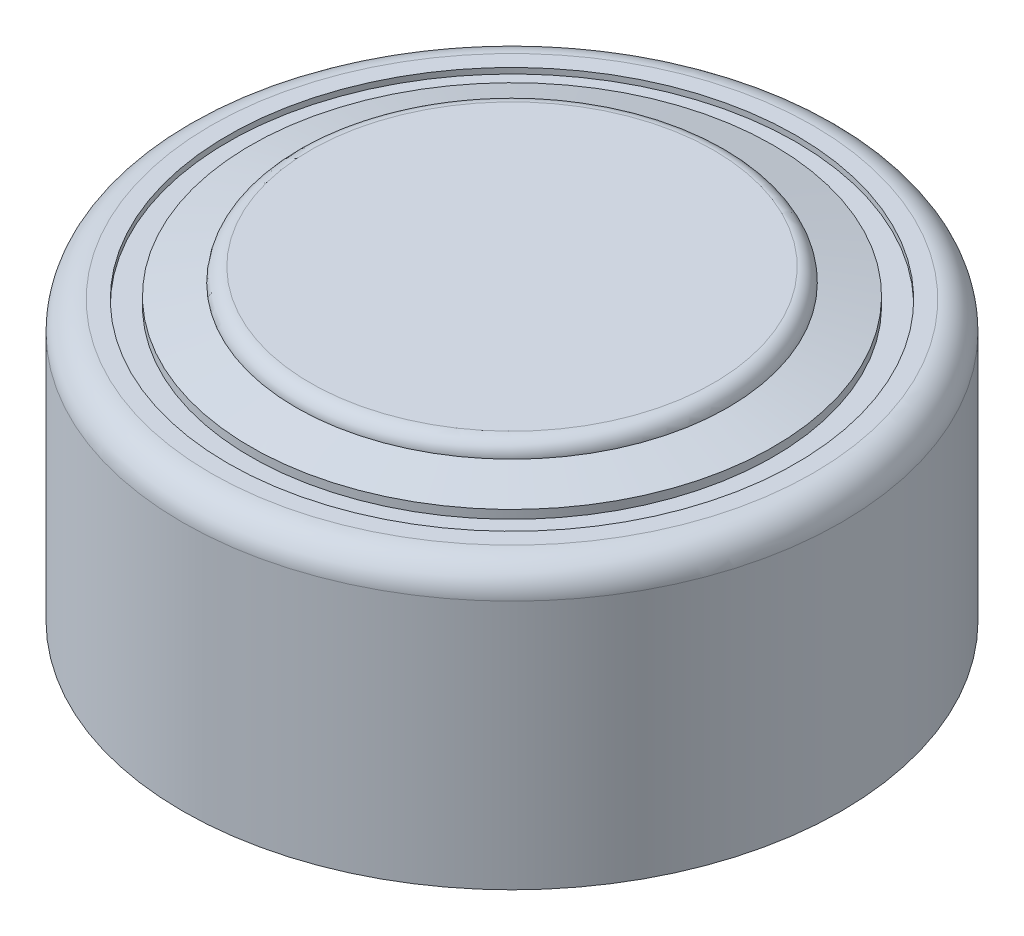
ISO-10303-21;
HEADER;
FILE_DESCRIPTION(('STEP AP214'),'2;1');
FILE_NAME('part.step','',(''),(''),'','','');
FILE_SCHEMA(('AUTOMOTIVE_DESIGN { 1 0 10303 214 1 1 1 1 }'));
ENDSEC;
DATA;
#1=APPLICATION_CONTEXT('core data for automotive mechanical design processes');
#2=APPLICATION_PROTOCOL_DEFINITION('international standard','automotive_design',2000,#1);
#3=PRODUCT_CONTEXT('',#1,'mechanical');
#4=PRODUCT('Part','Part','',(#3));
#5=PRODUCT_RELATED_PRODUCT_CATEGORY('part','',(#4));
#6=PRODUCT_DEFINITION_FORMATION('','',#4);
#7=PRODUCT_DEFINITION_CONTEXT('part definition',#1,'design');
#8=PRODUCT_DEFINITION('design','',#6,#7);
#9=PRODUCT_DEFINITION_SHAPE('','',#8);
#10=(LENGTH_UNIT() NAMED_UNIT(*) SI_UNIT(.MILLI.,.METRE.));
#11=(NAMED_UNIT(*) PLANE_ANGLE_UNIT() SI_UNIT($,.RADIAN.));
#12=(NAMED_UNIT(*) SI_UNIT($,.STERADIAN.) SOLID_ANGLE_UNIT());
#13=UNCERTAINTY_MEASURE_WITH_UNIT(LENGTH_MEASURE(1.E-05),#10,'distance_accuracy_value','');
#14=(GEOMETRIC_REPRESENTATION_CONTEXT(3) GLOBAL_UNCERTAINTY_ASSIGNED_CONTEXT((#13)) GLOBAL_UNIT_ASSIGNED_CONTEXT((#10,
#11,#12)) REPRESENTATION_CONTEXT('',''));
#15=CARTESIAN_POINT('',(0.,0.,0.));
#16=DIRECTION('',(0.,0.,1.));
#17=DIRECTION('',(1.,0.,0.));
#18=AXIS2_PLACEMENT_3D('',#15,#16,#17);
#19=CARTESIAN_POINT('',(0.,4.9,0.));
#20=DIRECTION('',(0.,-1.,0.));
#21=DIRECTION('',(0.,0.,-1.));
#22=AXIS2_PLACEMENT_3D('',#19,#20,#21);
#23=CYLINDRICAL_SURFACE('',#22,5.8);
#24=CARTESIAN_POINT('',(0.,4.4,0.));
#25=DIRECTION('',(0.,1.,0.));
#26=DIRECTION('',(0.,0.,1.));
#27=AXIS2_PLACEMENT_3D('',#24,#25,#26);
#28=CIRCLE('',#27,5.8);
#29=CARTESIAN_POINT('',(0.,4.4,5.8));
#30=VERTEX_POINT('',#29);
#31=EDGE_CURVE('E61',#30,#30,#28,.F.);
#32=ORIENTED_EDGE('',*,*,#31,.T.);
#33=EDGE_LOOP('',(#32));
#34=FACE_BOUND('',#33,.T.);
#35=CARTESIAN_POINT('',(0.,0.,0.));
#36=DIRECTION('',(0.,1.,0.));
#37=DIRECTION('',(0.,0.,1.));
#38=AXIS2_PLACEMENT_3D('',#35,#36,#37);
#39=CIRCLE('',#38,5.8);
#40=CARTESIAN_POINT('',(0.,0.,5.8));
#41=VERTEX_POINT('',#40);
#42=EDGE_CURVE('E76',#41,#41,#39,.T.);
#43=ORIENTED_EDGE('',*,*,#42,.T.);
#44=EDGE_LOOP('',(#43));
#45=FACE_BOUND('',#44,.T.);
#46=ADVANCED_FACE('F42',(#34,#45),#23,.T.);
#47=CARTESIAN_POINT('',(0.,4.9,0.));
#48=DIRECTION('',(0.,1.,0.));
#49=DIRECTION('',(0.,0.,1.));
#50=AXIS2_PLACEMENT_3D('',#47,#48,#49);
#51=PLANE('',#50);
#52=CARTESIAN_POINT('',(0.,4.9,0.));
#53=DIRECTION('',(0.,1.,0.));
#54=DIRECTION('',(0.,0.,1.));
#55=AXIS2_PLACEMENT_3D('',#52,#53,#54);
#56=CIRCLE('',#55,5.);
#57=CARTESIAN_POINT('',(0.,4.9,5.));
#58=VERTEX_POINT('',#57);
#59=EDGE_CURVE('E67',#58,#58,#56,.T.);
#60=ORIENTED_EDGE('',*,*,#59,.F.);
#61=EDGE_LOOP('',(#60));
#62=FACE_BOUND('',#61,.T.);
#63=CARTESIAN_POINT('',(0.,4.9,0.));
#64=DIRECTION('',(0.,1.,0.));
#65=DIRECTION('',(0.,0.,1.));
#66=AXIS2_PLACEMENT_3D('',#63,#64,#65);
#67=CIRCLE('',#66,5.3);
#68=CARTESIAN_POINT('',(0.,4.9,5.3));
#69=VERTEX_POINT('',#68);
#70=EDGE_CURVE('E72',#69,#69,#67,.T.);
#71=ORIENTED_EDGE('',*,*,#70,.T.);
#72=EDGE_LOOP('',(#71));
#73=FACE_BOUND('',#72,.T.);
#74=ADVANCED_FACE('F97',(#62,#73),#51,.T.);
#75=CARTESIAN_POINT('',(0.,0.,0.));
#76=DIRECTION('',(0.,1.,0.));
#77=DIRECTION('',(0.,0.,1.));
#78=AXIS2_PLACEMENT_3D('',#75,#76,#77);
#79=PLANE('',#78);
#80=ORIENTED_EDGE('',*,*,#42,.F.);
#81=EDGE_LOOP('',(#80));
#82=FACE_BOUND('',#81,.T.);
#83=ADVANCED_FACE('F100',(#82),#79,.F.);
#84=CARTESIAN_POINT('',(0.,4.4,0.));
#85=DIRECTION('',(0.,1.,0.));
#86=DIRECTION('',(0.,0.,1.));
#87=AXIS2_PLACEMENT_3D('',#84,#85,#86);
#88=TOROIDAL_SURFACE('',#87,5.3,0.5);
#89=ORIENTED_EDGE('',*,*,#31,.F.);
#90=EDGE_LOOP('',(#89));
#91=FACE_BOUND('',#90,.T.);
#92=ORIENTED_EDGE('',*,*,#70,.F.);
#93=EDGE_LOOP('',(#92));
#94=FACE_BOUND('',#93,.T.);
#95=ADVANCED_FACE('F93',(#91,#94),#88,.T.);
#96=CARTESIAN_POINT('',(0.,4.8,0.));
#97=DIRECTION('',(0.,1.,0.));
#98=DIRECTION('',(0.,0.,1.));
#99=AXIS2_PLACEMENT_3D('',#96,#97,#98);
#100=CYLINDRICAL_SURFACE('',#99,5.);
#101=CARTESIAN_POINT('',(0.,4.8,0.));
#102=DIRECTION('',(0.,1.,0.));
#103=DIRECTION('',(0.,0.,1.));
#104=AXIS2_PLACEMENT_3D('',#101,#102,#103);
#105=CIRCLE('',#104,5.);
#106=CARTESIAN_POINT('',(0.,4.8,5.));
#107=VERTEX_POINT('',#106);
#108=EDGE_CURVE('E80',#107,#107,#105,.T.);
#109=ORIENTED_EDGE('',*,*,#108,.F.);
#110=EDGE_LOOP('',(#109));
#111=FACE_BOUND('',#110,.T.);
#112=ORIENTED_EDGE('',*,*,#59,.T.);
#113=EDGE_LOOP('',(#112));
#114=FACE_BOUND('',#113,.T.);
#115=ADVANCED_FACE('F90',(#111,#114),#100,.F.);
#116=CARTESIAN_POINT('',(0.,4.8,0.));
#117=DIRECTION('',(0.,1.,0.));
#118=DIRECTION('',(0.,0.,1.));
#119=AXIS2_PLACEMENT_3D('',#116,#117,#118);
#120=PLANE('',#119);
#121=CARTESIAN_POINT('',(0.,4.8,0.));
#122=DIRECTION('',(0.,1.,0.));
#123=DIRECTION('',(0.,0.,1.));
#124=AXIS2_PLACEMENT_3D('',#121,#122,#123);
#125=CIRCLE('',#124,4.6);
#126=CARTESIAN_POINT('',(0.,4.8,-4.6));
#127=VERTEX_POINT('',#126);
#128=EDGE_CURVE('E56',#127,#127,#125,.T.);
#129=ORIENTED_EDGE('',*,*,#128,.F.);
#130=EDGE_LOOP('',(#129));
#131=FACE_BOUND('',#130,.T.);
#132=ORIENTED_EDGE('',*,*,#108,.T.);
#133=EDGE_LOOP('',(#132));
#134=FACE_BOUND('',#133,.T.);
#135=ADVANCED_FACE('F88',(#131,#134),#120,.T.);
#136=CARTESIAN_POINT('',(0.,5.15,0.));
#137=DIRECTION('',(0.,-1.,0.));
#138=DIRECTION('',(0.,0.,-1.));
#139=AXIS2_PLACEMENT_3D('',#136,#137,#138);
#140=CYLINDRICAL_SURFACE('',#139,4.6);
#141=CARTESIAN_POINT('',(0.,4.95,0.));
#142=DIRECTION('',(0.,-1.,0.));
#143=DIRECTION('',(0.,0.,-1.));
#144=AXIS2_PLACEMENT_3D('',#141,#142,#143);
#145=CIRCLE('',#144,4.6);
#146=CARTESIAN_POINT('',(0.,4.95,-4.6));
#147=VERTEX_POINT('',#146);
#148=EDGE_CURVE('E10',#147,#147,#145,.T.);
#149=CARTESIAN_POINT('',(0.,4.95,-4.6));
#150=CARTESIAN_POINT('',(0.,4.9484375,-4.6));
#151=CARTESIAN_POINT('',(0.,4.946875,-4.6));
#152=CARTESIAN_POINT('',(0.,4.94375,-4.6));
#153=CARTESIAN_POINT('',(0.,4.9421875,-4.6));
#154=CARTESIAN_POINT('',(0.,4.9390625,-4.6));
#155=CARTESIAN_POINT('',(0.,4.9375,-4.6));
#156=CARTESIAN_POINT('',(0.,4.934375,-4.6));
#157=CARTESIAN_POINT('',(0.,4.9328125,-4.6));
#158=CARTESIAN_POINT('',(0.,4.9296875,-4.6));
#159=CARTESIAN_POINT('',(0.,4.928125,-4.6));
#160=CARTESIAN_POINT('',(0.,4.925,-4.6));
#161=CARTESIAN_POINT('',(0.,4.9234375,-4.6));
#162=CARTESIAN_POINT('',(0.,4.9203125,-4.6));
#163=CARTESIAN_POINT('',(0.,4.91875,-4.6));
#164=CARTESIAN_POINT('',(0.,4.915625,-4.6));
#165=CARTESIAN_POINT('',(0.,4.9140625,-4.6));
#166=CARTESIAN_POINT('',(0.,4.9109375,-4.6));
#167=CARTESIAN_POINT('',(0.,4.909375,-4.6));
#168=CARTESIAN_POINT('',(0.,4.90625,-4.6));
#169=CARTESIAN_POINT('',(0.,4.9046875,-4.6));
#170=CARTESIAN_POINT('',(0.,4.9015625,-4.6));
#171=CARTESIAN_POINT('',(0.,4.9,-4.6));
#172=CARTESIAN_POINT('',(0.,4.896875,-4.6));
#173=CARTESIAN_POINT('',(0.,4.8953125,-4.6));
#174=CARTESIAN_POINT('',(0.,4.8921875,-4.6));
#175=CARTESIAN_POINT('',(0.,4.890625,-4.6));
#176=CARTESIAN_POINT('',(0.,4.8875,-4.6));
#177=CARTESIAN_POINT('',(0.,4.8859375,-4.6));
#178=CARTESIAN_POINT('',(0.,4.8828125,-4.6));
#179=CARTESIAN_POINT('',(0.,4.88125,-4.6));
#180=CARTESIAN_POINT('',(0.,4.878125,-4.6));
#181=CARTESIAN_POINT('',(0.,4.8765625,-4.6));
#182=CARTESIAN_POINT('',(0.,4.8734375,-4.6));
#183=CARTESIAN_POINT('',(0.,4.871875,-4.6));
#184=CARTESIAN_POINT('',(0.,4.86875,-4.6));
#185=CARTESIAN_POINT('',(0.,4.8671875,-4.6));
#186=CARTESIAN_POINT('',(0.,4.8640625,-4.6));
#187=CARTESIAN_POINT('',(0.,4.8625,-4.6));
#188=CARTESIAN_POINT('',(0.,4.859375,-4.6));
#189=CARTESIAN_POINT('',(0.,4.8578125,-4.6));
#190=CARTESIAN_POINT('',(0.,4.8546875,-4.6));
#191=CARTESIAN_POINT('',(0.,4.853125,-4.6));
#192=CARTESIAN_POINT('',(0.,4.85,-4.6));
#193=CARTESIAN_POINT('',(0.,4.8484375,-4.6));
#194=CARTESIAN_POINT('',(0.,4.8453125,-4.6));
#195=CARTESIAN_POINT('',(0.,4.84375,-4.6));
#196=CARTESIAN_POINT('',(0.,4.840625,-4.6));
#197=CARTESIAN_POINT('',(0.,4.8390625,-4.6));
#198=CARTESIAN_POINT('',(0.,4.8359375,-4.6));
#199=CARTESIAN_POINT('',(0.,4.834375,-4.6));
#200=CARTESIAN_POINT('',(0.,4.83125,-4.6));
#201=CARTESIAN_POINT('',(0.,4.8296875,-4.6));
#202=CARTESIAN_POINT('',(0.,4.8265625,-4.6));
#203=CARTESIAN_POINT('',(0.,4.825,-4.6));
#204=CARTESIAN_POINT('',(0.,4.821875,-4.6));
#205=CARTESIAN_POINT('',(0.,4.8203125,-4.6));
#206=CARTESIAN_POINT('',(0.,4.8171875,-4.6));
#207=CARTESIAN_POINT('',(0.,4.815625,-4.6));
#208=CARTESIAN_POINT('',(0.,4.8125,-4.6));
#209=CARTESIAN_POINT('',(0.,4.8109375,-4.6));
#210=CARTESIAN_POINT('',(0.,4.8078125,-4.6));
#211=CARTESIAN_POINT('',(0.,4.80625,-4.6));
#212=CARTESIAN_POINT('',(0.,4.803125,-4.6));
#213=CARTESIAN_POINT('',(0.,4.8015625,-4.6));
#214=CARTESIAN_POINT('',(0.,4.8,-4.6));
#215=B_SPLINE_CURVE_WITH_KNOTS('',3,(#149,#150,#151,#152,#153,#154,#155,#156,#157,#158,#159,
#160,#161,#162,#163,#164,#165,#166,#167,#168,#169,#170,#171,#172,#173,#174,#175,#176,#177,#178,
#179,#180,#181,#182,#183,#184,#185,#186,#187,#188,#189,#190,#191,#192,#193,#194,#195,#196,#197,
#198,#199,#200,#201,#202,#203,#204,#205,#206,#207,#208,#209,#210,#211,#212,#213,#214),
.UNSPECIFIED.,.F.,.F.,(4,2,2,2,2,2,2,2,2,2,2,2,2,2,2,2,2,2,2,2,2,2,2,2,2,2,2,2,2,2,2,2,4),(0.,
0.00468750000000035,0.0093750000000007,0.0140625000000002,0.0187500000000005,0.0234375,
0.0281250000000004,0.0328124999999999,0.0375000000000002,0.0421874999999997,0.046875,
0.0515624999999995,0.0562499999999999,0.0609374999999994,0.0656249999999997,0.0703124999999992,
0.0749999999999995,0.0796874999999999,0.0843749999999994,0.0890624999999997,0.0937499999999992,
0.0984374999999996,0.103124999999999,0.107812499999999,0.112499999999999,0.117187499999999,
0.121874999999999,0.126562499999999,0.131249999999999,0.135937499999999,0.140624999999999,
0.145312499999999,0.149999999999999),.UNSPECIFIED.);
#216=EDGE_CURVE('BSEAM122',#147,#127,#215,.T.);
#217=ORIENTED_EDGE('',*,*,#148,.T.);
#218=ORIENTED_EDGE('',*,*,#128,.T.);
#219=ORIENTED_EDGE('',*,*,#216,.T.);
#220=ORIENTED_EDGE('',*,*,#216,.F.);
#221=EDGE_LOOP('',(#217,#219,#218,#220));
#222=FACE_BOUND('',#221,.T.);
#223=ADVANCED_FACE('F122',(#222),#140,.T.);
#224=CARTESIAN_POINT('',(0.,5.4,0.));
#225=DIRECTION('',(0.,-1.,0.));
#226=DIRECTION('',(0.,0.,-1.));
#227=AXIS2_PLACEMENT_3D('',#224,#225,#226);
#228=PLANE('',#227);
#229=CARTESIAN_POINT('',(0.,5.4,0.));
#230=DIRECTION('',(0.,-1.,0.));
#231=DIRECTION('',(0.,0.,-1.));
#232=AXIS2_PLACEMENT_3D('',#229,#230,#231);
#233=CIRCLE('',#232,3.55);
#234=CARTESIAN_POINT('',(0.,5.4,-3.55));
#235=VERTEX_POINT('',#234);
#236=EDGE_CURVE('E51',#235,#235,#233,.F.);
#237=ORIENTED_EDGE('',*,*,#236,.T.);
#238=EDGE_LOOP('',(#237));
#239=FACE_BOUND('',#238,.T.);
#240=ADVANCED_FACE('F126',(#239),#228,.F.);
#241=CARTESIAN_POINT('',(0.,5.15,0.));
#242=DIRECTION('',(0.,-1.,0.));
#243=DIRECTION('',(0.,0.,-1.));
#244=AXIS2_PLACEMENT_3D('',#241,#242,#243);
#245=TOROIDAL_SURFACE('',#244,3.55,0.25);
#246=ORIENTED_EDGE('',*,*,#236,.F.);
#247=EDGE_LOOP('',(#246));
#248=FACE_BOUND('',#247,.T.);
#249=CARTESIAN_POINT('',(0.,5.15,0.));
#250=DIRECTION('',(0.,-1.,0.));
#251=DIRECTION('',(0.,0.,-1.));
#252=AXIS2_PLACEMENT_3D('',#249,#250,#251);
#253=CIRCLE('',#252,3.8);
#254=CARTESIAN_POINT('',(0.,5.15,-3.8));
#255=VERTEX_POINT('',#254);
#256=EDGE_CURVE('E64',#255,#255,#253,.T.);
#257=ORIENTED_EDGE('',*,*,#256,.F.);
#258=EDGE_LOOP('',(#257));
#259=FACE_BOUND('',#258,.T.);
#260=ADVANCED_FACE('F128',(#248,#259),#245,.T.);
#261=CARTESIAN_POINT('',(0.,4.95,0.));
#262=DIRECTION('',(0.,-1.,0.));
#263=DIRECTION('',(0.,0.,-1.));
#264=AXIS2_PLACEMENT_3D('',#261,#262,#263);
#265=CONICAL_SURFACE('',#264,4.6,1.32581766366803);
#266=ORIENTED_EDGE('',*,*,#256,.T.);
#267=EDGE_LOOP('',(#266));
#268=FACE_BOUND('',#267,.T.);
#269=ORIENTED_EDGE('',*,*,#148,.F.);
#270=EDGE_LOOP('',(#269));
#271=FACE_BOUND('',#270,.T.);
#272=ADVANCED_FACE('F45',(#268,#271),#265,.T.);
#273=CLOSED_SHELL('',(#46,#74,#83,#95,#115,#135,#223,#240,#260,#272));
#274=MANIFOLD_SOLID_BREP('B2',#273);
#275=ADVANCED_BREP_SHAPE_REPRESENTATION('',(#18,#274),#14);
#276=SHAPE_DEFINITION_REPRESENTATION(#9,#275);
ENDSEC;
END-ISO-10303-21;
